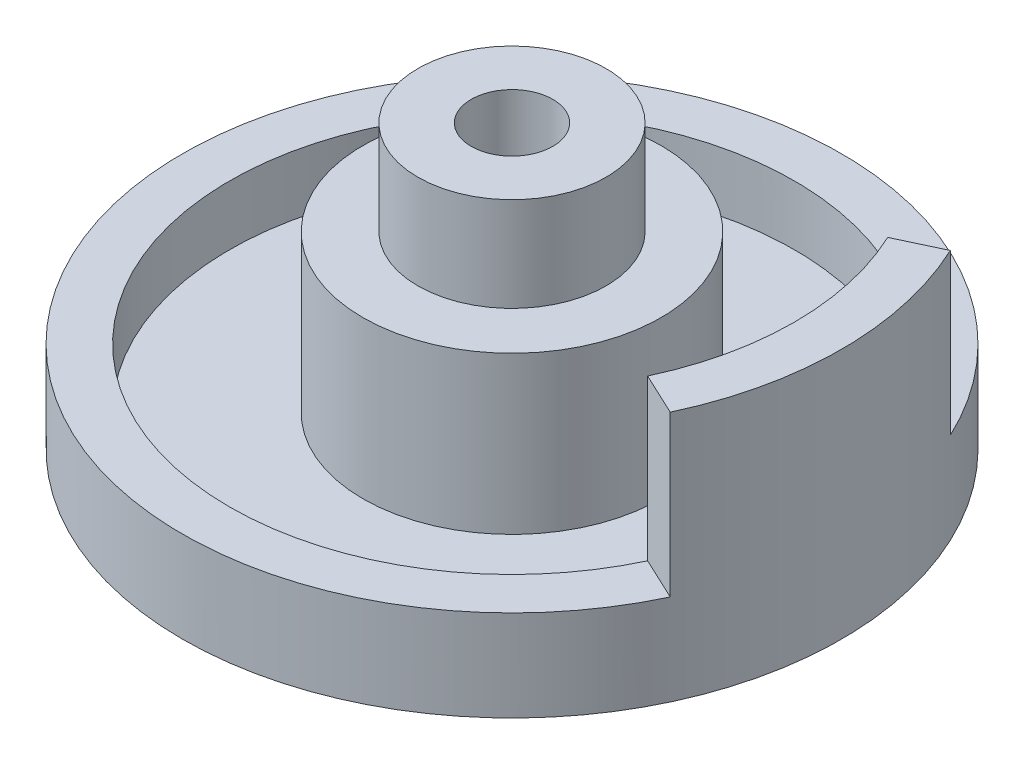
ISO-10303-21;
HEADER;
FILE_DESCRIPTION(('STEP AP214'),'2;1');
FILE_NAME('part.step','',(''),(''),'','','');
FILE_SCHEMA(('AUTOMOTIVE_DESIGN { 1 0 10303 214 1 1 1 1 }'));
ENDSEC;
DATA;
#1=APPLICATION_CONTEXT('core data for automotive mechanical design processes');
#2=APPLICATION_PROTOCOL_DEFINITION('international standard','automotive_design',2000,#1);
#3=PRODUCT_CONTEXT('',#1,'mechanical');
#4=PRODUCT('Part','Part','',(#3));
#5=PRODUCT_RELATED_PRODUCT_CATEGORY('part','',(#4));
#6=PRODUCT_DEFINITION_FORMATION('','',#4);
#7=PRODUCT_DEFINITION_CONTEXT('part definition',#1,'design');
#8=PRODUCT_DEFINITION('design','',#6,#7);
#9=PRODUCT_DEFINITION_SHAPE('','',#8);
#10=(LENGTH_UNIT() NAMED_UNIT(*) SI_UNIT(.MILLI.,.METRE.));
#11=(NAMED_UNIT(*) PLANE_ANGLE_UNIT() SI_UNIT($,.RADIAN.));
#12=(NAMED_UNIT(*) SI_UNIT($,.STERADIAN.) SOLID_ANGLE_UNIT());
#13=UNCERTAINTY_MEASURE_WITH_UNIT(LENGTH_MEASURE(1.E-05),#10,'distance_accuracy_value','');
#14=(GEOMETRIC_REPRESENTATION_CONTEXT(3) GLOBAL_UNCERTAINTY_ASSIGNED_CONTEXT((#13)) GLOBAL_UNIT_ASSIGNED_CONTEXT((#10,
#11,#12)) REPRESENTATION_CONTEXT('',''));
#15=CARTESIAN_POINT('',(0.,0.,0.));
#16=DIRECTION('',(0.,0.,1.));
#17=DIRECTION('',(1.,0.,0.));
#18=AXIS2_PLACEMENT_3D('',#15,#16,#17);
#19=CARTESIAN_POINT('',(0.,8.,0.));
#20=DIRECTION('',(0.,-1.,0.));
#21=DIRECTION('',(0.,0.,-1.));
#22=AXIS2_PLACEMENT_3D('',#19,#20,#21);
#23=CYLINDRICAL_SURFACE('',#22,10.5);
#24=CARTESIAN_POINT('',(0.,2.9,0.));
#25=DIRECTION('',(0.,1.,0.));
#26=DIRECTION('',(0.,0.,1.));
#27=AXIS2_PLACEMENT_3D('',#24,#25,#26);
#28=CIRCLE('',#27,10.5);
#29=CARTESIAN_POINT('',(9.50453016987163,2.9,4.4625));
#30=VERTEX_POINT('',#29);
#31=CARTESIAN_POINT('',(9.50453016987163,2.9,-4.4625));
#32=VERTEX_POINT('',#31);
#33=EDGE_CURVE('E126',#30,#32,#28,.F.);
#34=ORIENTED_EDGE('',*,*,#33,.T.);
#35=DIRECTION('',(0.,1.,0.));
#36=VECTOR('',#35,1.);
#37=CARTESIAN_POINT('',(9.50453016987163,6.,-4.4625));
#38=LINE('',#37,#36);
#39=CARTESIAN_POINT('',(9.50453016987163,8.,-4.4625));
#40=VERTEX_POINT('',#39);
#41=EDGE_CURVE('E145',#32,#40,#38,.T.);
#42=ORIENTED_EDGE('',*,*,#41,.T.);
#43=CARTESIAN_POINT('',(0.,8.,0.));
#44=DIRECTION('',(0.,1.,0.));
#45=DIRECTION('',(0.,0.,1.));
#46=AXIS2_PLACEMENT_3D('',#43,#44,#45);
#47=CIRCLE('',#46,10.5);
#48=CARTESIAN_POINT('',(9.50453016987163,8.,4.4625));
#49=VERTEX_POINT('',#48);
#50=EDGE_CURVE('E149',#49,#40,#47,.T.);
#51=ORIENTED_EDGE('',*,*,#50,.F.);
#52=DIRECTION('',(0.,1.,0.));
#53=VECTOR('',#52,1.);
#54=CARTESIAN_POINT('',(9.50453016987163,6.,4.4625));
#55=LINE('',#54,#53);
#56=EDGE_CURVE('E143',#30,#49,#55,.T.);
#57=ORIENTED_EDGE('',*,*,#56,.F.);
#58=EDGE_LOOP('',(#34,#42,#51,#57));
#59=FACE_BOUND('',#58,.T.);
#60=CARTESIAN_POINT('',(0.,0.,0.));
#61=DIRECTION('',(0.,1.,0.));
#62=DIRECTION('',(0.,0.,1.));
#63=AXIS2_PLACEMENT_3D('',#60,#61,#62);
#64=CIRCLE('',#63,10.5);
#65=CARTESIAN_POINT('',(0.,0.,10.5));
#66=VERTEX_POINT('',#65);
#67=EDGE_CURVE('E142',#66,#66,#64,.T.);
#68=ORIENTED_EDGE('',*,*,#67,.T.);
#69=EDGE_LOOP('',(#68));
#70=FACE_BOUND('',#69,.T.);
#71=ADVANCED_FACE('F36',(#59,#70),#23,.T.);
#72=CARTESIAN_POINT('',(0.,8.,0.));
#73=DIRECTION('',(0.,1.,0.));
#74=DIRECTION('',(0.,0.,1.));
#75=AXIS2_PLACEMENT_3D('',#72,#73,#74);
#76=PLANE('',#75);
#77=DIRECTION('',(-0.905193349511584,0.,-0.424999999999999));
#78=VECTOR('',#77,1.);
#79=CARTESIAN_POINT('',(8.14674014560425,8.,3.825));
#80=LINE('',#79,#78);
#81=CARTESIAN_POINT('',(8.14674014560425,8.,3.825));
#82=VERTEX_POINT('',#81);
#83=EDGE_CURVE('E136',#49,#82,#80,.T.);
#84=ORIENTED_EDGE('',*,*,#83,.F.);
#85=ORIENTED_EDGE('',*,*,#50,.T.);
#86=DIRECTION('',(0.905193349511584,0.,-0.424999999999999));
#87=VECTOR('',#86,1.);
#88=CARTESIAN_POINT('',(8.14674014560425,8.,-3.825));
#89=LINE('',#88,#87);
#90=CARTESIAN_POINT('',(8.14674014560425,8.,-3.82499999999999));
#91=VERTEX_POINT('',#90);
#92=EDGE_CURVE('E134',#91,#40,#89,.T.);
#93=ORIENTED_EDGE('',*,*,#92,.F.);
#94=CARTESIAN_POINT('',(0.,8.,0.));
#95=DIRECTION('',(0.,1.,0.));
#96=DIRECTION('',(0.,0.,1.));
#97=AXIS2_PLACEMENT_3D('',#94,#95,#96);
#98=CIRCLE('',#97,9.);
#99=EDGE_CURVE('E60',#82,#91,#98,.T.);
#100=ORIENTED_EDGE('',*,*,#99,.F.);
#101=EDGE_LOOP('',(#84,#85,#93,#100));
#102=FACE_BOUND('',#101,.T.);
#103=ADVANCED_FACE('F168',(#102),#76,.T.);
#104=CARTESIAN_POINT('',(0.,0.,0.));
#105=DIRECTION('',(0.,1.,0.));
#106=DIRECTION('',(0.,0.,1.));
#107=AXIS2_PLACEMENT_3D('',#104,#105,#106);
#108=PLANE('',#107);
#109=DIRECTION('',(0.,0.,1.));
#110=VECTOR('',#109,1.);
#111=CARTESIAN_POINT('',(1.5,0.,-2.59807621135332));
#112=LINE('',#111,#110);
#113=CARTESIAN_POINT('',(1.5,0.,-2.59807621135332));
#114=VERTEX_POINT('',#113);
#115=CARTESIAN_POINT('',(1.5,0.,2.59807621135332));
#116=VERTEX_POINT('',#115);
#117=EDGE_CURVE('E103',#114,#116,#112,.T.);
#118=ORIENTED_EDGE('',*,*,#117,.F.);
#119=CARTESIAN_POINT('',(0.,0.,0.));
#120=DIRECTION('',(0.,-1.,0.));
#121=DIRECTION('',(0.,0.,-1.));
#122=AXIS2_PLACEMENT_3D('',#119,#120,#121);
#123=CIRCLE('',#122,3.);
#124=EDGE_CURVE('E52',#116,#114,#123,.T.);
#125=ORIENTED_EDGE('',*,*,#124,.F.);
#126=EDGE_LOOP('',(#118,#125));
#127=FACE_BOUND('',#126,.T.);
#128=ORIENTED_EDGE('',*,*,#67,.F.);
#129=EDGE_LOOP('',(#128));
#130=FACE_BOUND('',#129,.T.);
#131=ADVANCED_FACE('F186',(#127,#130),#108,.F.);
#132=CARTESIAN_POINT('',(0.,6.,0.));
#133=DIRECTION('',(0.,1.,0.));
#134=DIRECTION('',(0.,0.,1.));
#135=AXIS2_PLACEMENT_3D('',#132,#133,#134);
#136=CYLINDRICAL_SURFACE('',#135,9.);
#137=ORIENTED_EDGE('',*,*,#99,.T.);
#138=DIRECTION('',(0.,1.,0.));
#139=VECTOR('',#138,1.);
#140=CARTESIAN_POINT('',(8.14674014560425,6.,-3.825));
#141=LINE('',#140,#139);
#142=CARTESIAN_POINT('',(8.14674014560425,2.9,-3.825));
#143=VERTEX_POINT('',#142);
#144=EDGE_CURVE('E139',#143,#91,#141,.T.);
#145=ORIENTED_EDGE('',*,*,#144,.F.);
#146=CARTESIAN_POINT('',(0.,2.9,0.));
#147=DIRECTION('',(0.,1.,0.));
#148=DIRECTION('',(0.,0.,1.));
#149=AXIS2_PLACEMENT_3D('',#146,#147,#148);
#150=CIRCLE('',#149,9.);
#151=CARTESIAN_POINT('',(8.14674014560425,2.9,3.825));
#152=VERTEX_POINT('',#151);
#153=EDGE_CURVE('E44',#143,#152,#150,.T.);
#154=ORIENTED_EDGE('',*,*,#153,.T.);
#155=DIRECTION('',(0.,1.,0.));
#156=VECTOR('',#155,1.);
#157=CARTESIAN_POINT('',(8.14674014560425,6.,3.825));
#158=LINE('',#157,#156);
#159=EDGE_CURVE('E140',#152,#82,#158,.T.);
#160=ORIENTED_EDGE('',*,*,#159,.T.);
#161=EDGE_LOOP('',(#137,#145,#154,#160));
#162=FACE_BOUND('',#161,.T.);
#163=CARTESIAN_POINT('',(0.,1.,0.));
#164=DIRECTION('',(0.,1.,0.));
#165=DIRECTION('',(0.,0.,1.));
#166=AXIS2_PLACEMENT_3D('',#163,#164,#165);
#167=CIRCLE('',#166,9.);
#168=CARTESIAN_POINT('',(0.,1.,9.));
#169=VERTEX_POINT('',#168);
#170=EDGE_CURVE('E114',#169,#169,#167,.F.);
#171=ORIENTED_EDGE('',*,*,#170,.T.);
#172=EDGE_LOOP('',(#171));
#173=FACE_BOUND('',#172,.T.);
#174=ADVANCED_FACE('F154',(#162,#173),#136,.F.);
#175=CARTESIAN_POINT('',(8.14674014560425,6.,3.825));
#176=DIRECTION('',(0.424999999999999,0.,-0.905193349511584));
#177=DIRECTION('',(-0.905193349511584,0.,-0.425));
#178=AXIS2_PLACEMENT_3D('',#175,#176,#177);
#179=PLANE('',#178);
#180=ORIENTED_EDGE('',*,*,#83,.T.);
#181=ORIENTED_EDGE('',*,*,#159,.F.);
#182=DIRECTION('',(0.905193349511584,0.,0.425));
#183=VECTOR('',#182,1.);
#184=CARTESIAN_POINT('',(9.50453016987163,2.9,4.4625));
#185=LINE('',#184,#183);
#186=EDGE_CURVE('E125',#152,#30,#185,.T.);
#187=ORIENTED_EDGE('',*,*,#186,.T.);
#188=ORIENTED_EDGE('',*,*,#56,.T.);
#189=EDGE_LOOP('',(#180,#181,#187,#188));
#190=FACE_BOUND('',#189,.T.);
#191=ADVANCED_FACE('F160',(#190),#179,.F.);
#192=CARTESIAN_POINT('',(8.14674014560425,6.,-3.825));
#193=DIRECTION('',(0.424999999999999,0.,0.905193349511584));
#194=DIRECTION('',(0.905193349511584,0.,-0.425));
#195=AXIS2_PLACEMENT_3D('',#192,#193,#194);
#196=PLANE('',#195);
#197=ORIENTED_EDGE('',*,*,#92,.T.);
#198=ORIENTED_EDGE('',*,*,#41,.F.);
#199=DIRECTION('',(-0.905193349511584,0.,0.424999999999999));
#200=VECTOR('',#199,1.);
#201=CARTESIAN_POINT('',(8.14674014560425,2.9,-3.825));
#202=LINE('',#201,#200);
#203=EDGE_CURVE('E122',#32,#143,#202,.T.);
#204=ORIENTED_EDGE('',*,*,#203,.T.);
#205=ORIENTED_EDGE('',*,*,#144,.T.);
#206=EDGE_LOOP('',(#197,#198,#204,#205));
#207=FACE_BOUND('',#206,.T.);
#208=ADVANCED_FACE('F171',(#207),#196,.F.);
#209=CARTESIAN_POINT('',(0.,2.9,0.));
#210=DIRECTION('',(0.,1.,0.));
#211=DIRECTION('',(0.,0.,1.));
#212=AXIS2_PLACEMENT_3D('',#209,#210,#211);
#213=PLANE('',#212);
#214=ORIENTED_EDGE('',*,*,#153,.F.);
#215=ORIENTED_EDGE('',*,*,#203,.F.);
#216=ORIENTED_EDGE('',*,*,#33,.F.);
#217=ORIENTED_EDGE('',*,*,#186,.F.);
#218=EDGE_LOOP('',(#214,#215,#216,#217));
#219=FACE_BOUND('',#218,.T.);
#220=ADVANCED_FACE('F163',(#219),#213,.T.);
#221=CARTESIAN_POINT('',(0.,1.,0.));
#222=DIRECTION('',(0.,1.,0.));
#223=DIRECTION('',(0.,0.,1.));
#224=AXIS2_PLACEMENT_3D('',#221,#222,#223);
#225=PLANE('',#224);
#226=ORIENTED_EDGE('',*,*,#170,.F.);
#227=EDGE_LOOP('',(#226));
#228=FACE_BOUND('',#227,.T.);
#229=CARTESIAN_POINT('',(0.,1.,0.));
#230=DIRECTION('',(0.,1.,0.));
#231=DIRECTION('',(0.,0.,1.));
#232=AXIS2_PLACEMENT_3D('',#229,#230,#231);
#233=CIRCLE('',#232,4.75);
#234=CARTESIAN_POINT('',(0.,1.,4.75));
#235=VERTEX_POINT('',#234);
#236=EDGE_CURVE('E118',#235,#235,#233,.F.);
#237=ORIENTED_EDGE('',*,*,#236,.T.);
#238=EDGE_LOOP('',(#237));
#239=FACE_BOUND('',#238,.T.);
#240=ADVANCED_FACE('F178',(#228,#239),#225,.T.);
#241=CARTESIAN_POINT('',(0.,6.,0.));
#242=DIRECTION('',(0.,1.,0.));
#243=DIRECTION('',(0.,0.,1.));
#244=AXIS2_PLACEMENT_3D('',#241,#242,#243);
#245=PLANE('',#244);
#246=CARTESIAN_POINT('',(0.,6.,0.));
#247=DIRECTION('',(0.,1.,0.));
#248=DIRECTION('',(0.,0.,1.));
#249=AXIS2_PLACEMENT_3D('',#246,#247,#248);
#250=CIRCLE('',#249,3.);
#251=CARTESIAN_POINT('',(0.,6.,3.));
#252=VERTEX_POINT('',#251);
#253=EDGE_CURVE('E12',#252,#252,#250,.T.);
#254=ORIENTED_EDGE('',*,*,#253,.F.);
#255=EDGE_LOOP('',(#254));
#256=FACE_BOUND('',#255,.T.);
#257=CARTESIAN_POINT('',(0.,6.,0.));
#258=DIRECTION('',(0.,1.,0.));
#259=DIRECTION('',(0.,0.,1.));
#260=AXIS2_PLACEMENT_3D('',#257,#258,#259);
#261=CIRCLE('',#260,4.75);
#262=CARTESIAN_POINT('',(0.,6.,4.75));
#263=VERTEX_POINT('',#262);
#264=EDGE_CURVE('E121',#263,#263,#261,.T.);
#265=ORIENTED_EDGE('',*,*,#264,.T.);
#266=EDGE_LOOP('',(#265));
#267=FACE_BOUND('',#266,.T.);
#268=ADVANCED_FACE('F224',(#256,#267),#245,.T.);
#269=CARTESIAN_POINT('',(0.,-29.0031244406065,0.));
#270=DIRECTION('',(0.,1.,0.));
#271=DIRECTION('',(0.,0.,1.));
#272=AXIS2_PLACEMENT_3D('',#269,#270,#271);
#273=CYLINDRICAL_SURFACE('',#272,4.75);
#274=ORIENTED_EDGE('',*,*,#264,.F.);
#275=EDGE_LOOP('',(#274));
#276=FACE_BOUND('',#275,.T.);
#277=ORIENTED_EDGE('',*,*,#236,.F.);
#278=EDGE_LOOP('',(#277));
#279=FACE_BOUND('',#278,.T.);
#280=ADVANCED_FACE('F232',(#276,#279),#273,.T.);
#281=CARTESIAN_POINT('',(0.,9.,0.));
#282=DIRECTION('',(0.,-1.,0.));
#283=DIRECTION('',(0.,0.,-1.));
#284=AXIS2_PLACEMENT_3D('',#281,#282,#283);
#285=CYLINDRICAL_SURFACE('',#284,3.);
#286=CARTESIAN_POINT('',(0.,9.,0.));
#287=DIRECTION('',(0.,1.,0.));
#288=DIRECTION('',(0.,0.,1.));
#289=AXIS2_PLACEMENT_3D('',#286,#287,#288);
#290=CIRCLE('',#289,3.);
#291=CARTESIAN_POINT('',(0.,9.,3.));
#292=VERTEX_POINT('',#291);
#293=EDGE_CURVE('E111',#292,#292,#290,.T.);
#294=ORIENTED_EDGE('',*,*,#293,.F.);
#295=EDGE_LOOP('',(#294));
#296=FACE_BOUND('',#295,.T.);
#297=ORIENTED_EDGE('',*,*,#253,.T.);
#298=EDGE_LOOP('',(#297));
#299=FACE_BOUND('',#298,.T.);
#300=ADVANCED_FACE('F236',(#296,#299),#285,.T.);
#301=CARTESIAN_POINT('',(0.,9.,0.));
#302=DIRECTION('',(0.,1.,0.));
#303=DIRECTION('',(0.,0.,1.));
#304=AXIS2_PLACEMENT_3D('',#301,#302,#303);
#305=PLANE('',#304);
#306=CARTESIAN_POINT('',(0.,9.,0.));
#307=DIRECTION('',(0.,1.,0.));
#308=DIRECTION('',(0.,0.,1.));
#309=AXIS2_PLACEMENT_3D('',#306,#307,#308);
#310=CIRCLE('',#309,1.29999999999999);
#311=CARTESIAN_POINT('',(0.,9.,1.29999999999999));
#312=VERTEX_POINT('',#311);
#313=EDGE_CURVE('E314',#312,#312,#310,.T.);
#314=ORIENTED_EDGE('',*,*,#313,.F.);
#315=EDGE_LOOP('',(#314));
#316=FACE_BOUND('',#315,.T.);
#317=ORIENTED_EDGE('',*,*,#293,.T.);
#318=EDGE_LOOP('',(#317));
#319=FACE_BOUND('',#318,.T.);
#320=ADVANCED_FACE('F253',(#316,#319),#305,.T.);
#321=CARTESIAN_POINT('',(0.,2.48,0.));
#322=DIRECTION('',(0.,-1.,0.));
#323=DIRECTION('',(0.,0.,-1.));
#324=AXIS2_PLACEMENT_3D('',#321,#322,#323);
#325=CYLINDRICAL_SURFACE('',#324,3.);
#326=ORIENTED_EDGE('',*,*,#124,.T.);
#327=DIRECTION('',(0.,-1.,0.));
#328=VECTOR('',#327,1.);
#329=CARTESIAN_POINT('',(1.5,2.48,-2.59807621135332));
#330=LINE('',#329,#328);
#331=CARTESIAN_POINT('',(1.5,2.48,-2.59807621135332));
#332=VERTEX_POINT('',#331);
#333=EDGE_CURVE('E89',#332,#114,#330,.T.);
#334=ORIENTED_EDGE('',*,*,#333,.F.);
#335=CARTESIAN_POINT('',(0.,2.48,0.));
#336=DIRECTION('',(0.,-1.,0.));
#337=DIRECTION('',(0.,0.,-1.));
#338=AXIS2_PLACEMENT_3D('',#335,#336,#337);
#339=CIRCLE('',#338,3.);
#340=CARTESIAN_POINT('',(1.5,2.48,2.59807621135332));
#341=VERTEX_POINT('',#340);
#342=EDGE_CURVE('E92',#341,#332,#339,.T.);
#343=ORIENTED_EDGE('',*,*,#342,.F.);
#344=DIRECTION('',(0.,-1.,0.));
#345=VECTOR('',#344,1.);
#346=CARTESIAN_POINT('',(1.5,2.48,2.59807621135332));
#347=LINE('',#346,#345);
#348=EDGE_CURVE('E98',#341,#116,#347,.T.);
#349=ORIENTED_EDGE('',*,*,#348,.T.);
#350=EDGE_LOOP('',(#326,#334,#343,#349));
#351=FACE_BOUND('',#350,.T.);
#352=ADVANCED_FACE('F91',(#351),#325,.F.);
#353=CARTESIAN_POINT('',(1.5,2.48,-2.59807621135332));
#354=DIRECTION('',(1.,0.,0.));
#355=DIRECTION('',(0.,0.,-1.));
#356=AXIS2_PLACEMENT_3D('',#353,#354,#355);
#357=PLANE('',#356);
#358=ORIENTED_EDGE('',*,*,#117,.T.);
#359=ORIENTED_EDGE('',*,*,#348,.F.);
#360=DIRECTION('',(0.,0.,1.));
#361=VECTOR('',#360,1.);
#362=CARTESIAN_POINT('',(1.5,2.48,-2.59807621135332));
#363=LINE('',#362,#361);
#364=EDGE_CURVE('E99',#332,#341,#363,.T.);
#365=ORIENTED_EDGE('',*,*,#364,.F.);
#366=ORIENTED_EDGE('',*,*,#333,.T.);
#367=EDGE_LOOP('',(#358,#359,#365,#366));
#368=FACE_BOUND('',#367,.T.);
#369=ADVANCED_FACE('F105',(#368),#357,.F.);
#370=CARTESIAN_POINT('',(0.,2.48,0.));
#371=DIRECTION('',(0.,-1.,0.));
#372=DIRECTION('',(0.,0.,-1.));
#373=AXIS2_PLACEMENT_3D('',#370,#371,#372);
#374=PLANE('',#373);
#375=CARTESIAN_POINT('',(0.,2.48,0.));
#376=DIRECTION('',(0.,-1.,0.));
#377=DIRECTION('',(0.,0.,-1.));
#378=AXIS2_PLACEMENT_3D('',#375,#376,#377);
#379=CIRCLE('',#378,1.29999999999999);
#380=CARTESIAN_POINT('',(0.,2.48,-1.29999999999999));
#381=VERTEX_POINT('',#380);
#382=EDGE_CURVE('E39',#381,#381,#379,.T.);
#383=ORIENTED_EDGE('',*,*,#382,.F.);
#384=EDGE_LOOP('',(#383));
#385=FACE_BOUND('',#384,.T.);
#386=ORIENTED_EDGE('',*,*,#342,.T.);
#387=ORIENTED_EDGE('',*,*,#364,.T.);
#388=EDGE_LOOP('',(#386,#387));
#389=FACE_BOUND('',#388,.T.);
#390=ADVANCED_FACE('F102',(#385,#389),#374,.T.);
#391=CARTESIAN_POINT('',(0.,9.,0.));
#392=DIRECTION('',(0.,1.,0.));
#393=DIRECTION('',(0.,0.,1.));
#394=AXIS2_PLACEMENT_3D('',#391,#392,#393);
#395=CYLINDRICAL_SURFACE('',#394,1.29999999999999);
#396=ORIENTED_EDGE('',*,*,#382,.T.);
#397=EDGE_LOOP('',(#396));
#398=FACE_BOUND('',#397,.T.);
#399=ORIENTED_EDGE('',*,*,#313,.T.);
#400=EDGE_LOOP('',(#399));
#401=FACE_BOUND('',#400,.T.);
#402=ADVANCED_FACE('F295',(#398,#401),#395,.F.);
#403=CLOSED_SHELL('',(#71,#103,#131,#174,#191,#208,#220,#240,#268,#280,#300,#320,#352,#369,#390,#402));
#404=MANIFOLD_SOLID_BREP('B2',#403);
#405=ADVANCED_BREP_SHAPE_REPRESENTATION('',(#18,#404),#14);
#406=SHAPE_DEFINITION_REPRESENTATION(#9,#405);
ENDSEC;
END-ISO-10303-21;
